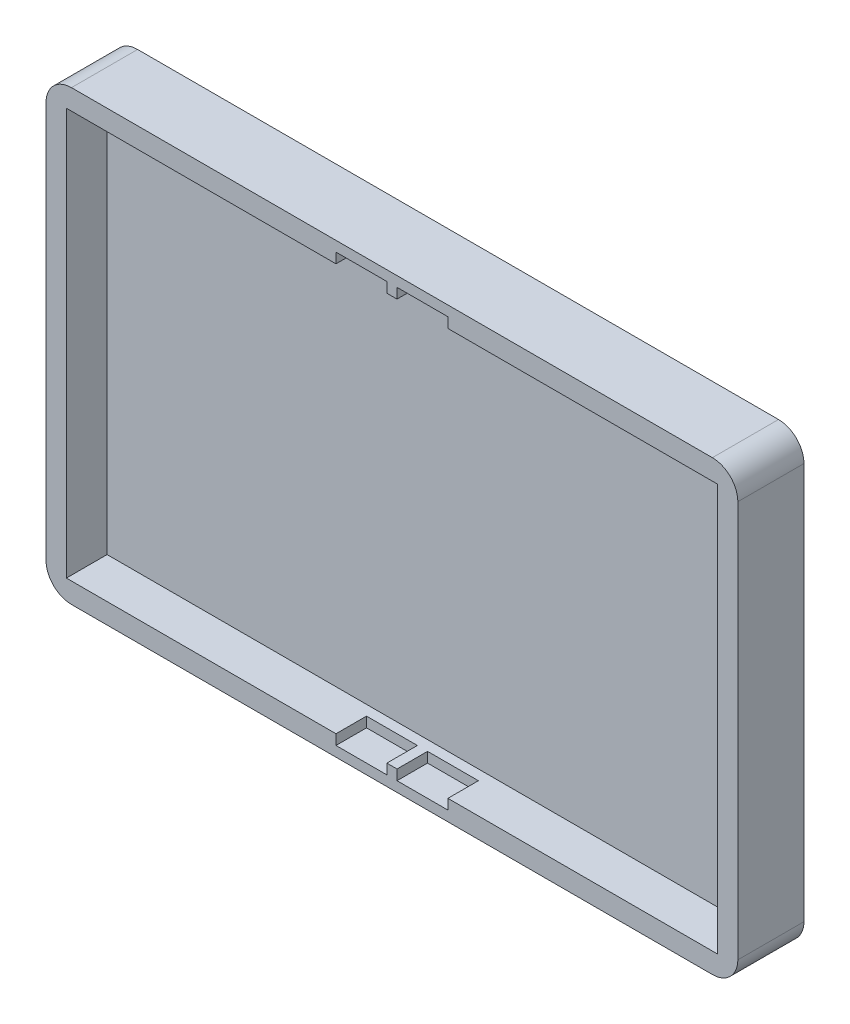
ISO-10303-21;
HEADER;
FILE_DESCRIPTION(('STEP AP214'),'2;1');
FILE_NAME('part.step','',(''),(''),'','','');
FILE_SCHEMA(('AUTOMOTIVE_DESIGN { 1 0 10303 214 1 1 1 1 }'));
ENDSEC;
DATA;
#1=APPLICATION_CONTEXT('core data for automotive mechanical design processes');
#2=APPLICATION_PROTOCOL_DEFINITION('international standard','automotive_design',2000,#1);
#3=PRODUCT_CONTEXT('',#1,'mechanical');
#4=PRODUCT('Part','Part','',(#3));
#5=PRODUCT_RELATED_PRODUCT_CATEGORY('part','',(#4));
#6=PRODUCT_DEFINITION_FORMATION('','',#4);
#7=PRODUCT_DEFINITION_CONTEXT('part definition',#1,'design');
#8=PRODUCT_DEFINITION('design','',#6,#7);
#9=PRODUCT_DEFINITION_SHAPE('','',#8);
#10=(LENGTH_UNIT() NAMED_UNIT(*) SI_UNIT(.MILLI.,.METRE.));
#11=(NAMED_UNIT(*) PLANE_ANGLE_UNIT() SI_UNIT($,.RADIAN.));
#12=(NAMED_UNIT(*) SI_UNIT($,.STERADIAN.) SOLID_ANGLE_UNIT());
#13=UNCERTAINTY_MEASURE_WITH_UNIT(LENGTH_MEASURE(1.E-05),#10,'distance_accuracy_value','');
#14=(GEOMETRIC_REPRESENTATION_CONTEXT(3) GLOBAL_UNCERTAINTY_ASSIGNED_CONTEXT((#13)) GLOBAL_UNIT_ASSIGNED_CONTEXT((#10,
#11,#12)) REPRESENTATION_CONTEXT('',''));
#15=CARTESIAN_POINT('',(0.,0.,0.));
#16=DIRECTION('',(0.,0.,1.));
#17=DIRECTION('',(1.,0.,0.));
#18=AXIS2_PLACEMENT_3D('',#15,#16,#17);
#19=CARTESIAN_POINT('',(66.,2.,2.5));
#20=DIRECTION('',(0.,-1.,0.));
#21=DIRECTION('',(1.,0.,0.));
#22=AXIS2_PLACEMENT_3D('',#19,#20,#21);
#23=PLANE('',#22);
#24=DIRECTION('',(1.,0.,0.));
#25=VECTOR('',#24,1.);
#26=CARTESIAN_POINT('',(66.,2.,6.5));
#27=LINE('',#26,#25);
#28=CARTESIAN_POINT('',(33.5,2.,6.5));
#29=VERTEX_POINT('',#28);
#30=CARTESIAN_POINT('',(34.5,2.,6.5));
#31=VERTEX_POINT('',#30);
#32=EDGE_CURVE('E406',#29,#31,#27,.T.);
#33=ORIENTED_EDGE('',*,*,#32,.T.);
#34=DIRECTION('',(0.,0.,1.));
#35=VECTOR('',#34,1.);
#36=CARTESIAN_POINT('',(34.5,2.,2.5));
#37=LINE('',#36,#35);
#38=CARTESIAN_POINT('',(34.5,2.,3.5));
#39=VERTEX_POINT('',#38);
#40=EDGE_CURVE('E358',#39,#31,#37,.T.);
#41=ORIENTED_EDGE('',*,*,#40,.F.);
#42=DIRECTION('',(-1.,0.,0.));
#43=VECTOR('',#42,1.);
#44=CARTESIAN_POINT('',(66.,2.,3.5));
#45=LINE('',#44,#43);
#46=CARTESIAN_POINT('',(39.5,2.,3.5));
#47=VERTEX_POINT('',#46);
#48=EDGE_CURVE('E355',#47,#39,#45,.T.);
#49=ORIENTED_EDGE('',*,*,#48,.F.);
#50=DIRECTION('',(0.,0.,-1.));
#51=VECTOR('',#50,1.);
#52=CARTESIAN_POINT('',(39.5,2.,2.5));
#53=LINE('',#52,#51);
#54=CARTESIAN_POINT('',(39.5,2.,6.5));
#55=VERTEX_POINT('',#54);
#56=EDGE_CURVE('E324',#55,#47,#53,.T.);
#57=ORIENTED_EDGE('',*,*,#56,.F.);
#58=CARTESIAN_POINT('',(66.,2.,6.5));
#59=VERTEX_POINT('',#58);
#60=EDGE_CURVE('E402',#55,#59,#27,.T.);
#61=ORIENTED_EDGE('',*,*,#60,.T.);
#62=DIRECTION('',(0.,0.,1.));
#63=VECTOR('',#62,1.);
#64=CARTESIAN_POINT('',(66.,2.,2.5));
#65=LINE('',#64,#63);
#66=CARTESIAN_POINT('',(66.,2.,2.5));
#67=VERTEX_POINT('',#66);
#68=EDGE_CURVE('E407',#67,#59,#65,.T.);
#69=ORIENTED_EDGE('',*,*,#68,.F.);
#70=DIRECTION('',(1.,0.,0.));
#71=VECTOR('',#70,1.);
#72=CARTESIAN_POINT('',(66.,2.,2.5));
#73=LINE('',#72,#71);
#74=CARTESIAN_POINT('',(2.,1.99999999999999,2.5));
#75=VERTEX_POINT('',#74);
#76=EDGE_CURVE('E385',#75,#67,#73,.T.);
#77=ORIENTED_EDGE('',*,*,#76,.F.);
#78=DIRECTION('',(0.,0.,1.));
#79=VECTOR('',#78,1.);
#80=CARTESIAN_POINT('',(2.,1.99999999999999,2.5));
#81=LINE('',#80,#79);
#82=CARTESIAN_POINT('',(2.,1.99999999999999,6.5));
#83=VERTEX_POINT('',#82);
#84=EDGE_CURVE('E412',#75,#83,#81,.T.);
#85=ORIENTED_EDGE('',*,*,#84,.T.);
#86=CARTESIAN_POINT('',(28.5,2.,6.5));
#87=VERTEX_POINT('',#86);
#88=EDGE_CURVE('E377',#83,#87,#27,.T.);
#89=ORIENTED_EDGE('',*,*,#88,.T.);
#90=DIRECTION('',(0.,0.,1.));
#91=VECTOR('',#90,1.);
#92=CARTESIAN_POINT('',(28.5,2.,2.5));
#93=LINE('',#92,#91);
#94=CARTESIAN_POINT('',(28.5,2.,3.5));
#95=VERTEX_POINT('',#94);
#96=EDGE_CURVE('E364',#95,#87,#93,.T.);
#97=ORIENTED_EDGE('',*,*,#96,.F.);
#98=DIRECTION('',(-1.,0.,0.));
#99=VECTOR('',#98,1.);
#100=CARTESIAN_POINT('',(66.,2.,3.50000000000001));
#101=LINE('',#100,#99);
#102=CARTESIAN_POINT('',(33.5,2.,3.5));
#103=VERTEX_POINT('',#102);
#104=EDGE_CURVE('E361',#103,#95,#101,.T.);
#105=ORIENTED_EDGE('',*,*,#104,.F.);
#106=DIRECTION('',(0.,0.,-1.));
#107=VECTOR('',#106,1.);
#108=CARTESIAN_POINT('',(33.5,2.,2.5));
#109=LINE('',#108,#107);
#110=EDGE_CURVE('E367',#29,#103,#109,.T.);
#111=ORIENTED_EDGE('',*,*,#110,.F.);
#112=EDGE_LOOP('',(#33,#41,#49,#57,#61,#69,#77,#85,#89,#97,#105,#111));
#113=FACE_BOUND('',#112,.T.);
#114=ADVANCED_FACE('F43',(#113),#23,.F.);
#115=CARTESIAN_POINT('',(66.,42.,2.5));
#116=DIRECTION('',(0.,1.,0.));
#117=DIRECTION('',(-1.,0.,0.));
#118=AXIS2_PLACEMENT_3D('',#115,#116,#117);
#119=PLANE('',#118);
#120=DIRECTION('',(0.,0.,-1.));
#121=VECTOR('',#120,1.);
#122=CARTESIAN_POINT('',(28.5,42.,2.5));
#123=LINE('',#122,#121);
#124=CARTESIAN_POINT('',(28.5,42.,6.5));
#125=VERTEX_POINT('',#124);
#126=CARTESIAN_POINT('',(28.5,42.,3.5));
#127=VERTEX_POINT('',#126);
#128=EDGE_CURVE('E463',#125,#127,#123,.T.);
#129=ORIENTED_EDGE('',*,*,#128,.F.);
#130=DIRECTION('',(-1.,0.,0.));
#131=VECTOR('',#130,1.);
#132=CARTESIAN_POINT('',(66.,42.,6.5));
#133=LINE('',#132,#131);
#134=CARTESIAN_POINT('',(2.,42.,6.5));
#135=VERTEX_POINT('',#134);
#136=EDGE_CURVE('E392',#125,#135,#133,.T.);
#137=ORIENTED_EDGE('',*,*,#136,.T.);
#138=DIRECTION('',(0.,0.,1.));
#139=VECTOR('',#138,1.);
#140=CARTESIAN_POINT('',(2.,42.,2.5));
#141=LINE('',#140,#139);
#142=CARTESIAN_POINT('',(2.,42.,2.5));
#143=VERTEX_POINT('',#142);
#144=EDGE_CURVE('E415',#143,#135,#141,.T.);
#145=ORIENTED_EDGE('',*,*,#144,.F.);
#146=DIRECTION('',(-1.,0.,0.));
#147=VECTOR('',#146,1.);
#148=CARTESIAN_POINT('',(66.,42.,2.5));
#149=LINE('',#148,#147);
#150=CARTESIAN_POINT('',(66.,42.,2.5));
#151=VERTEX_POINT('',#150);
#152=EDGE_CURVE('E376',#151,#143,#149,.T.);
#153=ORIENTED_EDGE('',*,*,#152,.F.);
#154=DIRECTION('',(0.,0.,1.));
#155=VECTOR('',#154,1.);
#156=CARTESIAN_POINT('',(66.,42.,2.5));
#157=LINE('',#156,#155);
#158=CARTESIAN_POINT('',(66.,42.,6.5));
#159=VERTEX_POINT('',#158);
#160=EDGE_CURVE('E389',#151,#159,#157,.T.);
#161=ORIENTED_EDGE('',*,*,#160,.T.);
#162=CARTESIAN_POINT('',(39.5,42.,6.5));
#163=VERTEX_POINT('',#162);
#164=EDGE_CURVE('E393',#159,#163,#133,.T.);
#165=ORIENTED_EDGE('',*,*,#164,.T.);
#166=DIRECTION('',(0.,0.,1.));
#167=VECTOR('',#166,1.);
#168=CARTESIAN_POINT('',(39.5,42.,2.5));
#169=LINE('',#168,#167);
#170=CARTESIAN_POINT('',(39.5,42.,3.5));
#171=VERTEX_POINT('',#170);
#172=EDGE_CURVE('E437',#171,#163,#169,.T.);
#173=ORIENTED_EDGE('',*,*,#172,.F.);
#174=DIRECTION('',(1.,0.,0.));
#175=VECTOR('',#174,1.);
#176=CARTESIAN_POINT('',(66.,42.,3.5));
#177=LINE('',#176,#175);
#178=CARTESIAN_POINT('',(34.5,42.,3.5));
#179=VERTEX_POINT('',#178);
#180=EDGE_CURVE('E453',#179,#171,#177,.T.);
#181=ORIENTED_EDGE('',*,*,#180,.F.);
#182=DIRECTION('',(0.,0.,-1.));
#183=VECTOR('',#182,1.);
#184=CARTESIAN_POINT('',(34.5,42.,2.5));
#185=LINE('',#184,#183);
#186=CARTESIAN_POINT('',(34.5,42.,6.5));
#187=VERTEX_POINT('',#186);
#188=EDGE_CURVE('E457',#187,#179,#185,.T.);
#189=ORIENTED_EDGE('',*,*,#188,.F.);
#190=CARTESIAN_POINT('',(33.5,42.,6.5));
#191=VERTEX_POINT('',#190);
#192=EDGE_CURVE('E398',#187,#191,#133,.T.);
#193=ORIENTED_EDGE('',*,*,#192,.T.);
#194=DIRECTION('',(0.,0.,1.));
#195=VECTOR('',#194,1.);
#196=CARTESIAN_POINT('',(33.5,42.,2.5));
#197=LINE('',#196,#195);
#198=CARTESIAN_POINT('',(33.5,42.,3.5));
#199=VERTEX_POINT('',#198);
#200=EDGE_CURVE('E250',#199,#191,#197,.T.);
#201=ORIENTED_EDGE('',*,*,#200,.F.);
#202=DIRECTION('',(1.,0.,0.));
#203=VECTOR('',#202,1.);
#204=CARTESIAN_POINT('',(66.,42.,3.50000000000001));
#205=LINE('',#204,#203);
#206=EDGE_CURVE('E460',#127,#199,#205,.T.);
#207=ORIENTED_EDGE('',*,*,#206,.F.);
#208=EDGE_LOOP('',(#129,#137,#145,#153,#161,#165,#173,#181,#189,#193,#201,#207));
#209=FACE_BOUND('',#208,.T.);
#210=ADVANCED_FACE('F536',(#209),#119,.F.);
#211=CARTESIAN_POINT('',(0.,0.,6.5));
#212=DIRECTION('',(1.,0.,0.));
#213=DIRECTION('',(0.,0.,-1.));
#214=AXIS2_PLACEMENT_3D('',#211,#212,#213);
#215=PLANE('',#214);
#216=DIRECTION('',(0.,-1.,0.));
#217=VECTOR('',#216,1.);
#218=CARTESIAN_POINT('',(0.,0.,6.5));
#219=LINE('',#218,#217);
#220=CARTESIAN_POINT('',(0.,41.5,6.5));
#221=VERTEX_POINT('',#220);
#222=CARTESIAN_POINT('',(0.,2.5,6.5));
#223=VERTEX_POINT('',#222);
#224=EDGE_CURVE('E422',#221,#223,#219,.T.);
#225=ORIENTED_EDGE('',*,*,#224,.F.);
#226=DIRECTION('',(0.,0.,-1.));
#227=VECTOR('',#226,1.);
#228=CARTESIAN_POINT('',(0.,41.5,6.5));
#229=LINE('',#228,#227);
#230=CARTESIAN_POINT('',(0.,41.5,0.));
#231=VERTEX_POINT('',#230);
#232=EDGE_CURVE('E472',#221,#231,#229,.T.);
#233=ORIENTED_EDGE('',*,*,#232,.T.);
#234=DIRECTION('',(0.,-1.,0.));
#235=VECTOR('',#234,1.);
#236=CARTESIAN_POINT('',(0.,0.,0.));
#237=LINE('',#236,#235);
#238=CARTESIAN_POINT('',(0.,2.5,0.));
#239=VERTEX_POINT('',#238);
#240=EDGE_CURVE('E411',#231,#239,#237,.T.);
#241=ORIENTED_EDGE('',*,*,#240,.T.);
#242=DIRECTION('',(0.,0.,-1.));
#243=VECTOR('',#242,1.);
#244=CARTESIAN_POINT('',(0.,2.5,6.5));
#245=LINE('',#244,#243);
#246=EDGE_CURVE('E469',#239,#223,#245,.F.);
#247=ORIENTED_EDGE('',*,*,#246,.T.);
#248=EDGE_LOOP('',(#225,#233,#241,#247));
#249=FACE_BOUND('',#248,.T.);
#250=ADVANCED_FACE('F606',(#249),#215,.F.);
#251=CARTESIAN_POINT('',(0.,0.,6.5));
#252=DIRECTION('',(0.,1.,0.));
#253=DIRECTION('',(0.,0.,1.));
#254=AXIS2_PLACEMENT_3D('',#251,#252,#253);
#255=PLANE('',#254);
#256=DIRECTION('',(1.,0.,0.));
#257=VECTOR('',#256,1.);
#258=CARTESIAN_POINT('',(0.,0.,6.5));
#259=LINE('',#258,#257);
#260=CARTESIAN_POINT('',(2.5,0.,6.5));
#261=VERTEX_POINT('',#260);
#262=CARTESIAN_POINT('',(65.5,0.,6.5));
#263=VERTEX_POINT('',#262);
#264=EDGE_CURVE('E426',#261,#263,#259,.T.);
#265=ORIENTED_EDGE('',*,*,#264,.F.);
#266=DIRECTION('',(0.,0.,-1.));
#267=VECTOR('',#266,1.);
#268=CARTESIAN_POINT('',(2.5,0.,6.5));
#269=LINE('',#268,#267);
#270=CARTESIAN_POINT('',(2.5,0.,0.));
#271=VERTEX_POINT('',#270);
#272=EDGE_CURVE('E509',#261,#271,#269,.T.);
#273=ORIENTED_EDGE('',*,*,#272,.T.);
#274=DIRECTION('',(1.,0.,0.));
#275=VECTOR('',#274,1.);
#276=CARTESIAN_POINT('',(0.,0.,0.));
#277=LINE('',#276,#275);
#278=CARTESIAN_POINT('',(65.5,0.,0.));
#279=VERTEX_POINT('',#278);
#280=EDGE_CURVE('E441',#271,#279,#277,.T.);
#281=ORIENTED_EDGE('',*,*,#280,.T.);
#282=DIRECTION('',(0.,0.,-1.));
#283=VECTOR('',#282,1.);
#284=CARTESIAN_POINT('',(65.5,0.,6.5));
#285=LINE('',#284,#283);
#286=EDGE_CURVE('E506',#279,#263,#285,.F.);
#287=ORIENTED_EDGE('',*,*,#286,.T.);
#288=EDGE_LOOP('',(#265,#273,#281,#287));
#289=FACE_BOUND('',#288,.T.);
#290=ADVANCED_FACE('F630',(#289),#255,.F.);
#291=CARTESIAN_POINT('',(68.,0.,6.5));
#292=DIRECTION('',(-1.,0.,0.));
#293=DIRECTION('',(0.,0.,1.));
#294=AXIS2_PLACEMENT_3D('',#291,#292,#293);
#295=PLANE('',#294);
#296=DIRECTION('',(0.,1.,0.));
#297=VECTOR('',#296,1.);
#298=CARTESIAN_POINT('',(68.,0.,6.5));
#299=LINE('',#298,#297);
#300=CARTESIAN_POINT('',(68.,2.5,6.5));
#301=VERTEX_POINT('',#300);
#302=CARTESIAN_POINT('',(68.,41.5,6.5));
#303=VERTEX_POINT('',#302);
#304=EDGE_CURVE('E430',#301,#303,#299,.T.);
#305=ORIENTED_EDGE('',*,*,#304,.F.);
#306=DIRECTION('',(0.,0.,-1.));
#307=VECTOR('',#306,1.);
#308=CARTESIAN_POINT('',(68.,2.5,6.5));
#309=LINE('',#308,#307);
#310=CARTESIAN_POINT('',(68.,2.5,0.));
#311=VERTEX_POINT('',#310);
#312=EDGE_CURVE('E11',#301,#311,#309,.T.);
#313=ORIENTED_EDGE('',*,*,#312,.T.);
#314=DIRECTION('',(0.,1.,0.));
#315=VECTOR('',#314,1.);
#316=CARTESIAN_POINT('',(68.,0.,0.));
#317=LINE('',#316,#315);
#318=CARTESIAN_POINT('',(68.,41.5,0.));
#319=VERTEX_POINT('',#318);
#320=EDGE_CURVE('E445',#311,#319,#317,.T.);
#321=ORIENTED_EDGE('',*,*,#320,.T.);
#322=DIRECTION('',(0.,0.,-1.));
#323=VECTOR('',#322,1.);
#324=CARTESIAN_POINT('',(68.,41.5,6.5));
#325=LINE('',#324,#323);
#326=EDGE_CURVE('E52',#319,#303,#325,.F.);
#327=ORIENTED_EDGE('',*,*,#326,.T.);
#328=EDGE_LOOP('',(#305,#313,#321,#327));
#329=FACE_BOUND('',#328,.T.);
#330=ADVANCED_FACE('F626',(#329),#295,.F.);
#331=CARTESIAN_POINT('',(0.,44.,6.5));
#332=DIRECTION('',(0.,-1.,0.));
#333=DIRECTION('',(0.,0.,-1.));
#334=AXIS2_PLACEMENT_3D('',#331,#332,#333);
#335=PLANE('',#334);
#336=DIRECTION('',(-1.,0.,0.));
#337=VECTOR('',#336,1.);
#338=CARTESIAN_POINT('',(0.,44.,0.));
#339=LINE('',#338,#337);
#340=CARTESIAN_POINT('',(65.5,44.,0.));
#341=VERTEX_POINT('',#340);
#342=CARTESIAN_POINT('',(2.5,44.,0.));
#343=VERTEX_POINT('',#342);
#344=EDGE_CURVE('E427',#341,#343,#339,.T.);
#345=ORIENTED_EDGE('',*,*,#344,.T.);
#346=DIRECTION('',(0.,0.,-1.));
#347=VECTOR('',#346,1.);
#348=CARTESIAN_POINT('',(2.5,44.,6.5));
#349=LINE('',#348,#347);
#350=CARTESIAN_POINT('',(2.5,44.,6.5));
#351=VERTEX_POINT('',#350);
#352=EDGE_CURVE('E492',#343,#351,#349,.F.);
#353=ORIENTED_EDGE('',*,*,#352,.T.);
#354=DIRECTION('',(-1.,0.,0.));
#355=VECTOR('',#354,1.);
#356=CARTESIAN_POINT('',(0.,44.,6.5));
#357=LINE('',#356,#355);
#358=CARTESIAN_POINT('',(65.5,44.,6.5));
#359=VERTEX_POINT('',#358);
#360=EDGE_CURVE('E433',#359,#351,#357,.T.);
#361=ORIENTED_EDGE('',*,*,#360,.F.);
#362=DIRECTION('',(0.,0.,-1.));
#363=VECTOR('',#362,1.);
#364=CARTESIAN_POINT('',(65.5,44.,6.5));
#365=LINE('',#364,#363);
#366=EDGE_CURVE('E488',#359,#341,#365,.T.);
#367=ORIENTED_EDGE('',*,*,#366,.T.);
#368=EDGE_LOOP('',(#345,#353,#361,#367));
#369=FACE_BOUND('',#368,.T.);
#370=ADVANCED_FACE('F620',(#369),#335,.F.);
#371=CARTESIAN_POINT('',(0.,0.,6.5));
#372=DIRECTION('',(0.,0.,-1.));
#373=DIRECTION('',(-1.,0.,0.));
#374=AXIS2_PLACEMENT_3D('',#371,#372,#373);
#375=PLANE('',#374);
#376=ORIENTED_EDGE('',*,*,#136,.F.);
#377=DIRECTION('',(0.,-1.,0.));
#378=VECTOR('',#377,1.);
#379=CARTESIAN_POINT('',(28.5,43.,6.5));
#380=LINE('',#379,#378);
#381=CARTESIAN_POINT('',(28.5,43.,6.5));
#382=VERTEX_POINT('',#381);
#383=EDGE_CURVE('E255',#382,#125,#380,.T.);
#384=ORIENTED_EDGE('',*,*,#383,.F.);
#385=DIRECTION('',(-1.,0.,0.));
#386=VECTOR('',#385,1.);
#387=CARTESIAN_POINT('',(28.5,43.,6.5));
#388=LINE('',#387,#386);
#389=CARTESIAN_POINT('',(33.5,43.,6.5));
#390=VERTEX_POINT('',#389);
#391=EDGE_CURVE('E236',#390,#382,#388,.T.);
#392=ORIENTED_EDGE('',*,*,#391,.F.);
#393=DIRECTION('',(0.,-1.,0.));
#394=VECTOR('',#393,1.);
#395=CARTESIAN_POINT('',(33.5,43.,6.5));
#396=LINE('',#395,#394);
#397=EDGE_CURVE('E247',#390,#191,#396,.T.);
#398=ORIENTED_EDGE('',*,*,#397,.T.);
#399=ORIENTED_EDGE('',*,*,#192,.F.);
#400=DIRECTION('',(0.,-1.,0.));
#401=VECTOR('',#400,1.);
#402=CARTESIAN_POINT('',(34.5,43.,6.5));
#403=LINE('',#402,#401);
#404=CARTESIAN_POINT('',(34.5,43.,6.5));
#405=VERTEX_POINT('',#404);
#406=EDGE_CURVE('E282',#405,#187,#403,.T.);
#407=ORIENTED_EDGE('',*,*,#406,.F.);
#408=DIRECTION('',(-1.,0.,0.));
#409=VECTOR('',#408,1.);
#410=CARTESIAN_POINT('',(39.5,43.,6.5));
#411=LINE('',#410,#409);
#412=CARTESIAN_POINT('',(39.5,43.,6.5));
#413=VERTEX_POINT('',#412);
#414=EDGE_CURVE('E274',#413,#405,#411,.T.);
#415=ORIENTED_EDGE('',*,*,#414,.F.);
#416=DIRECTION('',(0.,-1.,0.));
#417=VECTOR('',#416,1.);
#418=CARTESIAN_POINT('',(39.5,43.,6.5));
#419=LINE('',#418,#417);
#420=EDGE_CURVE('E281',#413,#163,#419,.T.);
#421=ORIENTED_EDGE('',*,*,#420,.T.);
#422=ORIENTED_EDGE('',*,*,#164,.F.);
#423=DIRECTION('',(0.,1.,0.));
#424=VECTOR('',#423,1.);
#425=CARTESIAN_POINT('',(66.,42.,6.5));
#426=LINE('',#425,#424);
#427=EDGE_CURVE('E371',#59,#159,#426,.T.);
#428=ORIENTED_EDGE('',*,*,#427,.F.);
#429=ORIENTED_EDGE('',*,*,#60,.F.);
#430=DIRECTION('',(0.,1.,0.));
#431=VECTOR('',#430,1.);
#432=CARTESIAN_POINT('',(39.5,0.999999999999997,6.5));
#433=LINE('',#432,#431);
#434=CARTESIAN_POINT('',(39.5,0.999999999999997,6.5));
#435=VERTEX_POINT('',#434);
#436=EDGE_CURVE('E270',#435,#55,#433,.T.);
#437=ORIENTED_EDGE('',*,*,#436,.F.);
#438=DIRECTION('',(1.,0.,0.));
#439=VECTOR('',#438,1.);
#440=CARTESIAN_POINT('',(34.5,0.999999999999996,6.5));
#441=LINE('',#440,#439);
#442=CARTESIAN_POINT('',(34.5,0.999999999999996,6.5));
#443=VERTEX_POINT('',#442);
#444=EDGE_CURVE('E264',#443,#435,#441,.T.);
#445=ORIENTED_EDGE('',*,*,#444,.F.);
#446=DIRECTION('',(0.,1.,0.));
#447=VECTOR('',#446,1.);
#448=CARTESIAN_POINT('',(34.5,0.999999999999996,6.5));
#449=LINE('',#448,#447);
#450=EDGE_CURVE('E269',#443,#31,#449,.T.);
#451=ORIENTED_EDGE('',*,*,#450,.T.);
#452=ORIENTED_EDGE('',*,*,#32,.F.);
#453=DIRECTION('',(0.,1.,0.));
#454=VECTOR('',#453,1.);
#455=CARTESIAN_POINT('',(33.5,0.999999999999996,6.5));
#456=LINE('',#455,#454);
#457=CARTESIAN_POINT('',(33.5,0.999999999999996,6.5));
#458=VERTEX_POINT('',#457);
#459=EDGE_CURVE('E294',#458,#29,#456,.T.);
#460=ORIENTED_EDGE('',*,*,#459,.F.);
#461=DIRECTION('',(1.,0.,0.));
#462=VECTOR('',#461,1.);
#463=CARTESIAN_POINT('',(28.5,0.999999999999995,6.5));
#464=LINE('',#463,#462);
#465=CARTESIAN_POINT('',(28.5,0.999999999999995,6.5));
#466=VERTEX_POINT('',#465);
#467=EDGE_CURVE('E286',#466,#458,#464,.T.);
#468=ORIENTED_EDGE('',*,*,#467,.F.);
#469=DIRECTION('',(0.,1.,0.));
#470=VECTOR('',#469,1.);
#471=CARTESIAN_POINT('',(28.5,0.999999999999995,6.5));
#472=LINE('',#471,#470);
#473=EDGE_CURVE('E293',#466,#87,#472,.T.);
#474=ORIENTED_EDGE('',*,*,#473,.T.);
#475=ORIENTED_EDGE('',*,*,#88,.F.);
#476=DIRECTION('',(0.,-1.,0.));
#477=VECTOR('',#476,1.);
#478=CARTESIAN_POINT('',(2.,42.,6.5));
#479=LINE('',#478,#477);
#480=EDGE_CURVE('E397',#135,#83,#479,.T.);
#481=ORIENTED_EDGE('',*,*,#480,.F.);
#482=EDGE_LOOP('',(#376,#384,#392,#398,#399,#407,#415,#421,#422,#428,#429,#437,#445,#451,#452,
#460,#468,#474,#475,#481));
#483=FACE_BOUND('',#482,.T.);
#484=ORIENTED_EDGE('',*,*,#360,.T.);
#485=CARTESIAN_POINT('',(2.5,41.5,6.5));
#486=DIRECTION('',(0.,0.,-1.));
#487=DIRECTION('',(-1.,0.,0.));
#488=AXIS2_PLACEMENT_3D('',#485,#486,#487);
#489=CIRCLE('',#488,2.5);
#490=EDGE_CURVE('E503',#351,#221,#489,.F.);
#491=ORIENTED_EDGE('',*,*,#490,.T.);
#492=ORIENTED_EDGE('',*,*,#224,.T.);
#493=CARTESIAN_POINT('',(2.5,2.5,6.5));
#494=DIRECTION('',(0.,0.,-1.));
#495=DIRECTION('',(-1.,0.,0.));
#496=AXIS2_PLACEMENT_3D('',#493,#494,#495);
#497=CIRCLE('',#496,2.5);
#498=EDGE_CURVE('E500',#223,#261,#497,.F.);
#499=ORIENTED_EDGE('',*,*,#498,.T.);
#500=ORIENTED_EDGE('',*,*,#264,.T.);
#501=CARTESIAN_POINT('',(65.5,2.5,6.5));
#502=DIRECTION('',(0.,0.,-1.));
#503=DIRECTION('',(-1.,0.,0.));
#504=AXIS2_PLACEMENT_3D('',#501,#502,#503);
#505=CIRCLE('',#504,2.5);
#506=EDGE_CURVE('E65',#263,#301,#505,.F.);
#507=ORIENTED_EDGE('',*,*,#506,.T.);
#508=ORIENTED_EDGE('',*,*,#304,.T.);
#509=CARTESIAN_POINT('',(65.5,41.5,6.5));
#510=DIRECTION('',(0.,0.,-1.));
#511=DIRECTION('',(-1.,0.,0.));
#512=AXIS2_PLACEMENT_3D('',#509,#510,#511);
#513=CIRCLE('',#512,2.5);
#514=EDGE_CURVE('E495',#303,#359,#513,.F.);
#515=ORIENTED_EDGE('',*,*,#514,.T.);
#516=EDGE_LOOP('',(#484,#491,#492,#499,#500,#507,#508,#515));
#517=FACE_BOUND('',#516,.T.);
#518=ADVANCED_FACE('F258',(#483,#517),#375,.F.);
#519=CARTESIAN_POINT('',(0.,0.,0.));
#520=DIRECTION('',(0.,0.,-1.));
#521=DIRECTION('',(-1.,0.,0.));
#522=AXIS2_PLACEMENT_3D('',#519,#520,#521);
#523=PLANE('',#522);
#524=ORIENTED_EDGE('',*,*,#240,.F.);
#525=CARTESIAN_POINT('',(2.5,41.5,0.));
#526=DIRECTION('',(0.,0.,-1.));
#527=DIRECTION('',(-1.,0.,0.));
#528=AXIS2_PLACEMENT_3D('',#525,#526,#527);
#529=CIRCLE('',#528,2.5);
#530=EDGE_CURVE('E485',#231,#343,#529,.T.);
#531=ORIENTED_EDGE('',*,*,#530,.T.);
#532=ORIENTED_EDGE('',*,*,#344,.F.);
#533=CARTESIAN_POINT('',(65.5,41.5,0.));
#534=DIRECTION('',(0.,0.,-1.));
#535=DIRECTION('',(-1.,0.,0.));
#536=AXIS2_PLACEMENT_3D('',#533,#534,#535);
#537=CIRCLE('',#536,2.5);
#538=EDGE_CURVE('E476',#341,#319,#537,.T.);
#539=ORIENTED_EDGE('',*,*,#538,.T.);
#540=ORIENTED_EDGE('',*,*,#320,.F.);
#541=CARTESIAN_POINT('',(65.5,2.5,0.));
#542=DIRECTION('',(0.,0.,-1.));
#543=DIRECTION('',(-1.,0.,0.));
#544=AXIS2_PLACEMENT_3D('',#541,#542,#543);
#545=CIRCLE('',#544,2.5);
#546=EDGE_CURVE('E479',#311,#279,#545,.T.);
#547=ORIENTED_EDGE('',*,*,#546,.T.);
#548=ORIENTED_EDGE('',*,*,#280,.F.);
#549=CARTESIAN_POINT('',(2.5,2.5,0.));
#550=DIRECTION('',(0.,0.,-1.));
#551=DIRECTION('',(-1.,0.,0.));
#552=AXIS2_PLACEMENT_3D('',#549,#550,#551);
#553=CIRCLE('',#552,2.5);
#554=EDGE_CURVE('E482',#271,#239,#553,.T.);
#555=ORIENTED_EDGE('',*,*,#554,.T.);
#556=EDGE_LOOP('',(#524,#531,#532,#539,#540,#547,#548,#555));
#557=FACE_BOUND('',#556,.T.);
#558=ADVANCED_FACE('F617',(#557),#523,.T.);
#559=CARTESIAN_POINT('',(66.,42.,2.5));
#560=DIRECTION('',(1.,0.,0.));
#561=DIRECTION('',(0.,0.,-1.));
#562=AXIS2_PLACEMENT_3D('',#559,#560,#561);
#563=PLANE('',#562);
#564=ORIENTED_EDGE('',*,*,#427,.T.);
#565=ORIENTED_EDGE('',*,*,#160,.F.);
#566=DIRECTION('',(0.,1.,0.));
#567=VECTOR('',#566,1.);
#568=CARTESIAN_POINT('',(66.,42.,2.5));
#569=LINE('',#568,#567);
#570=EDGE_CURVE('E372',#67,#151,#569,.T.);
#571=ORIENTED_EDGE('',*,*,#570,.F.);
#572=ORIENTED_EDGE('',*,*,#68,.T.);
#573=EDGE_LOOP('',(#564,#565,#571,#572));
#574=FACE_BOUND('',#573,.T.);
#575=ADVANCED_FACE('F546',(#574),#563,.F.);
#576=CARTESIAN_POINT('',(2.,42.,2.5));
#577=DIRECTION('',(-1.,0.,0.));
#578=DIRECTION('',(0.,0.,1.));
#579=AXIS2_PLACEMENT_3D('',#576,#577,#578);
#580=PLANE('',#579);
#581=ORIENTED_EDGE('',*,*,#480,.T.);
#582=ORIENTED_EDGE('',*,*,#84,.F.);
#583=DIRECTION('',(0.,-1.,0.));
#584=VECTOR('',#583,1.);
#585=CARTESIAN_POINT('',(2.,42.,2.5));
#586=LINE('',#585,#584);
#587=EDGE_CURVE('E381',#143,#75,#586,.T.);
#588=ORIENTED_EDGE('',*,*,#587,.F.);
#589=ORIENTED_EDGE('',*,*,#144,.T.);
#590=EDGE_LOOP('',(#581,#582,#588,#589));
#591=FACE_BOUND('',#590,.T.);
#592=ADVANCED_FACE('F611',(#591),#580,.F.);
#593=CARTESIAN_POINT('',(0.,0.,2.5));
#594=DIRECTION('',(0.,0.,-1.));
#595=DIRECTION('',(-1.,0.,0.));
#596=AXIS2_PLACEMENT_3D('',#593,#594,#595);
#597=PLANE('',#596);
#598=ORIENTED_EDGE('',*,*,#570,.T.);
#599=ORIENTED_EDGE('',*,*,#152,.T.);
#600=ORIENTED_EDGE('',*,*,#587,.T.);
#601=ORIENTED_EDGE('',*,*,#76,.T.);
#602=EDGE_LOOP('',(#598,#599,#600,#601));
#603=FACE_BOUND('',#602,.T.);
#604=ADVANCED_FACE('F551',(#603),#597,.F.);
#605=CARTESIAN_POINT('',(0.,43.,0.));
#606=DIRECTION('',(0.,-1.,0.));
#607=DIRECTION('',(0.,0.,-1.));
#608=AXIS2_PLACEMENT_3D('',#605,#606,#607);
#609=PLANE('',#608);
#610=DIRECTION('',(0.,0.,1.));
#611=VECTOR('',#610,1.);
#612=CARTESIAN_POINT('',(39.5,43.,5.5));
#613=LINE('',#612,#611);
#614=CARTESIAN_POINT('',(39.5,43.,3.5));
#615=VERTEX_POINT('',#614);
#616=EDGE_CURVE('E343',#615,#413,#613,.T.);
#617=ORIENTED_EDGE('',*,*,#616,.T.);
#618=ORIENTED_EDGE('',*,*,#414,.T.);
#619=DIRECTION('',(0.,0.,-1.));
#620=VECTOR('',#619,1.);
#621=CARTESIAN_POINT('',(34.5,43.,5.5));
#622=LINE('',#621,#620);
#623=CARTESIAN_POINT('',(34.5,43.,3.5));
#624=VERTEX_POINT('',#623);
#625=EDGE_CURVE('E244',#405,#624,#622,.T.);
#626=ORIENTED_EDGE('',*,*,#625,.T.);
#627=DIRECTION('',(1.,0.,0.));
#628=VECTOR('',#627,1.);
#629=CARTESIAN_POINT('',(39.5,43.,3.5));
#630=LINE('',#629,#628);
#631=EDGE_CURVE('E346',#624,#615,#630,.T.);
#632=ORIENTED_EDGE('',*,*,#631,.T.);
#633=EDGE_LOOP('',(#617,#618,#626,#632));
#634=FACE_BOUND('',#633,.T.);
#635=ADVANCED_FACE('F531',(#634),#609,.T.);
#636=CARTESIAN_POINT('',(39.5,0.999999999999973,5.5));
#637=DIRECTION('',(-1.,0.,0.));
#638=DIRECTION('',(0.,-1.,0.));
#639=AXIS2_PLACEMENT_3D('',#636,#637,#638);
#640=PLANE('',#639);
#641=ORIENTED_EDGE('',*,*,#172,.T.);
#642=ORIENTED_EDGE('',*,*,#420,.F.);
#643=ORIENTED_EDGE('',*,*,#616,.F.);
#644=DIRECTION('',(0.,1.,0.));
#645=VECTOR('',#644,1.);
#646=CARTESIAN_POINT('',(39.5,0.999999999999973,3.5));
#647=LINE('',#646,#645);
#648=EDGE_CURVE('E329',#171,#615,#647,.T.);
#649=ORIENTED_EDGE('',*,*,#648,.F.);
#650=EDGE_LOOP('',(#641,#642,#643,#649));
#651=FACE_BOUND('',#650,.T.);
#652=ADVANCED_FACE('F541',(#651),#640,.T.);
#653=CARTESIAN_POINT('',(39.5,0.999999999999973,3.5));
#654=DIRECTION('',(0.,0.,1.));
#655=DIRECTION('',(1.,0.,0.));
#656=AXIS2_PLACEMENT_3D('',#653,#654,#655);
#657=PLANE('',#656);
#658=ORIENTED_EDGE('',*,*,#180,.T.);
#659=ORIENTED_EDGE('',*,*,#648,.T.);
#660=ORIENTED_EDGE('',*,*,#631,.F.);
#661=DIRECTION('',(0.,1.,0.));
#662=VECTOR('',#661,1.);
#663=CARTESIAN_POINT('',(34.5,0.999999999999973,3.5));
#664=LINE('',#663,#662);
#665=EDGE_CURVE('E298',#179,#624,#664,.T.);
#666=ORIENTED_EDGE('',*,*,#665,.F.);
#667=EDGE_LOOP('',(#658,#659,#660,#666));
#668=FACE_BOUND('',#667,.T.);
#669=ADVANCED_FACE('F528',(#668),#657,.T.);
#670=CARTESIAN_POINT('',(34.5,0.999999999999973,5.5));
#671=DIRECTION('',(1.,0.,0.));
#672=DIRECTION('',(0.,1.,0.));
#673=AXIS2_PLACEMENT_3D('',#670,#671,#672);
#674=PLANE('',#673);
#675=ORIENTED_EDGE('',*,*,#188,.T.);
#676=ORIENTED_EDGE('',*,*,#665,.T.);
#677=ORIENTED_EDGE('',*,*,#625,.F.);
#678=ORIENTED_EDGE('',*,*,#406,.T.);
#679=EDGE_LOOP('',(#675,#676,#677,#678));
#680=FACE_BOUND('',#679,.T.);
#681=ADVANCED_FACE('F525',(#680),#674,.T.);
#682=CARTESIAN_POINT('',(0.,43.,0.));
#683=DIRECTION('',(0.,1.,0.));
#684=DIRECTION('',(-1.,0.,0.));
#685=AXIS2_PLACEMENT_3D('',#682,#683,#684);
#686=PLANE('',#685);
#687=DIRECTION('',(0.,0.,1.));
#688=VECTOR('',#687,1.);
#689=CARTESIAN_POINT('',(33.5,43.,5.5));
#690=LINE('',#689,#688);
#691=CARTESIAN_POINT('',(33.5,43.,3.5));
#692=VERTEX_POINT('',#691);
#693=EDGE_CURVE('E231',#692,#390,#690,.T.);
#694=ORIENTED_EDGE('',*,*,#693,.T.);
#695=ORIENTED_EDGE('',*,*,#391,.T.);
#696=DIRECTION('',(0.,0.,-1.));
#697=VECTOR('',#696,1.);
#698=CARTESIAN_POINT('',(28.5,43.,5.5));
#699=LINE('',#698,#697);
#700=CARTESIAN_POINT('',(28.5,43.,3.5));
#701=VERTEX_POINT('',#700);
#702=EDGE_CURVE('E243',#382,#701,#699,.T.);
#703=ORIENTED_EDGE('',*,*,#702,.T.);
#704=DIRECTION('',(1.,0.,0.));
#705=VECTOR('',#704,1.);
#706=CARTESIAN_POINT('',(33.5,43.,3.5));
#707=LINE('',#706,#705);
#708=EDGE_CURVE('E239',#701,#692,#707,.T.);
#709=ORIENTED_EDGE('',*,*,#708,.T.);
#710=EDGE_LOOP('',(#694,#695,#703,#709));
#711=FACE_BOUND('',#710,.T.);
#712=ADVANCED_FACE('F233',(#711),#686,.F.);
#713=CARTESIAN_POINT('',(33.5,0.999999999999973,3.5));
#714=DIRECTION('',(0.,0.,1.));
#715=DIRECTION('',(1.,0.,0.));
#716=AXIS2_PLACEMENT_3D('',#713,#714,#715);
#717=PLANE('',#716);
#718=ORIENTED_EDGE('',*,*,#206,.T.);
#719=DIRECTION('',(0.,1.,0.));
#720=VECTOR('',#719,1.);
#721=CARTESIAN_POINT('',(33.5,0.999999999999973,3.5));
#722=LINE('',#721,#720);
#723=EDGE_CURVE('E315',#199,#692,#722,.T.);
#724=ORIENTED_EDGE('',*,*,#723,.T.);
#725=ORIENTED_EDGE('',*,*,#708,.F.);
#726=DIRECTION('',(0.,1.,0.));
#727=VECTOR('',#726,1.);
#728=CARTESIAN_POINT('',(28.5,0.999999999999966,3.5));
#729=LINE('',#728,#727);
#730=EDGE_CURVE('E319',#127,#701,#729,.T.);
#731=ORIENTED_EDGE('',*,*,#730,.F.);
#732=EDGE_LOOP('',(#718,#724,#725,#731));
#733=FACE_BOUND('',#732,.T.);
#734=ADVANCED_FACE('F590',(#733),#717,.T.);
#735=CARTESIAN_POINT('',(28.5,0.999999999999966,5.5));
#736=DIRECTION('',(1.,0.,0.));
#737=DIRECTION('',(0.,1.,0.));
#738=AXIS2_PLACEMENT_3D('',#735,#736,#737);
#739=PLANE('',#738);
#740=ORIENTED_EDGE('',*,*,#128,.T.);
#741=ORIENTED_EDGE('',*,*,#730,.T.);
#742=ORIENTED_EDGE('',*,*,#702,.F.);
#743=ORIENTED_EDGE('',*,*,#383,.T.);
#744=EDGE_LOOP('',(#740,#741,#742,#743));
#745=FACE_BOUND('',#744,.T.);
#746=ADVANCED_FACE('F598',(#745),#739,.T.);
#747=CARTESIAN_POINT('',(33.5,0.999999999999973,5.5));
#748=DIRECTION('',(-1.,0.,0.));
#749=DIRECTION('',(0.,-1.,0.));
#750=AXIS2_PLACEMENT_3D('',#747,#748,#749);
#751=PLANE('',#750);
#752=ORIENTED_EDGE('',*,*,#200,.T.);
#753=ORIENTED_EDGE('',*,*,#397,.F.);
#754=ORIENTED_EDGE('',*,*,#693,.F.);
#755=ORIENTED_EDGE('',*,*,#723,.F.);
#756=EDGE_LOOP('',(#752,#753,#754,#755));
#757=FACE_BOUND('',#756,.T.);
#758=ADVANCED_FACE('F248',(#757),#751,.T.);
#759=ORIENTED_EDGE('',*,*,#40,.T.);
#760=ORIENTED_EDGE('',*,*,#450,.F.);
#761=DIRECTION('',(0.,0.,-1.));
#762=VECTOR('',#761,1.);
#763=CARTESIAN_POINT('',(34.5,0.999999999999973,5.5));
#764=LINE('',#763,#762);
#765=CARTESIAN_POINT('',(34.5,0.999999999999973,3.5));
#766=VERTEX_POINT('',#765);
#767=EDGE_CURVE('E340',#443,#766,#764,.T.);
#768=ORIENTED_EDGE('',*,*,#767,.T.);
#769=EDGE_CURVE('E325',#766,#39,#664,.T.);
#770=ORIENTED_EDGE('',*,*,#769,.T.);
#771=EDGE_LOOP('',(#759,#760,#768,#770));
#772=FACE_BOUND('',#771,.T.);
#773=ADVANCED_FACE('F568',(#772),#674,.T.);
#774=ORIENTED_EDGE('',*,*,#48,.T.);
#775=ORIENTED_EDGE('',*,*,#769,.F.);
#776=DIRECTION('',(1.,0.,0.));
#777=VECTOR('',#776,1.);
#778=CARTESIAN_POINT('',(39.5,0.999999999999973,3.5));
#779=LINE('',#778,#777);
#780=CARTESIAN_POINT('',(39.5,0.999999999999973,3.5));
#781=VERTEX_POINT('',#780);
#782=EDGE_CURVE('E337',#766,#781,#779,.T.);
#783=ORIENTED_EDGE('',*,*,#782,.T.);
#784=EDGE_CURVE('E330',#781,#47,#647,.T.);
#785=ORIENTED_EDGE('',*,*,#784,.T.);
#786=EDGE_LOOP('',(#774,#775,#783,#785));
#787=FACE_BOUND('',#786,.T.);
#788=ADVANCED_FACE('F741',(#787),#657,.T.);
#789=ORIENTED_EDGE('',*,*,#56,.T.);
#790=ORIENTED_EDGE('',*,*,#784,.F.);
#791=DIRECTION('',(0.,0.,1.));
#792=VECTOR('',#791,1.);
#793=CARTESIAN_POINT('',(39.5,0.999999999999973,5.5));
#794=LINE('',#793,#792);
#795=EDGE_CURVE('E334',#781,#435,#794,.T.);
#796=ORIENTED_EDGE('',*,*,#795,.T.);
#797=ORIENTED_EDGE('',*,*,#436,.T.);
#798=EDGE_LOOP('',(#789,#790,#796,#797));
#799=FACE_BOUND('',#798,.T.);
#800=ADVANCED_FACE('F558',(#799),#640,.T.);
#801=CARTESIAN_POINT('',(0.,0.999999999999973,0.));
#802=DIRECTION('',(0.,-1.,0.));
#803=DIRECTION('',(0.,0.,-1.));
#804=AXIS2_PLACEMENT_3D('',#801,#802,#803);
#805=PLANE('',#804);
#806=ORIENTED_EDGE('',*,*,#767,.F.);
#807=ORIENTED_EDGE('',*,*,#444,.T.);
#808=ORIENTED_EDGE('',*,*,#795,.F.);
#809=ORIENTED_EDGE('',*,*,#782,.F.);
#810=EDGE_LOOP('',(#806,#807,#808,#809));
#811=FACE_BOUND('',#810,.T.);
#812=ADVANCED_FACE('F564',(#811),#805,.F.);
#813=ORIENTED_EDGE('',*,*,#110,.T.);
#814=CARTESIAN_POINT('',(33.5,0.999999999999973,3.5));
#815=VERTEX_POINT('',#814);
#816=EDGE_CURVE('E316',#815,#103,#722,.T.);
#817=ORIENTED_EDGE('',*,*,#816,.F.);
#818=DIRECTION('',(0.,0.,1.));
#819=VECTOR('',#818,1.);
#820=CARTESIAN_POINT('',(33.5,0.999999999999973,5.5));
#821=LINE('',#820,#819);
#822=EDGE_CURVE('E306',#815,#458,#821,.T.);
#823=ORIENTED_EDGE('',*,*,#822,.T.);
#824=ORIENTED_EDGE('',*,*,#459,.T.);
#825=EDGE_LOOP('',(#813,#817,#823,#824));
#826=FACE_BOUND('',#825,.T.);
#827=ADVANCED_FACE('F573',(#826),#751,.T.);
#828=ORIENTED_EDGE('',*,*,#96,.T.);
#829=ORIENTED_EDGE('',*,*,#473,.F.);
#830=DIRECTION('',(0.,0.,-1.));
#831=VECTOR('',#830,1.);
#832=CARTESIAN_POINT('',(28.5,0.999999999999966,5.5));
#833=LINE('',#832,#831);
#834=CARTESIAN_POINT('',(28.5,0.999999999999966,3.5));
#835=VERTEX_POINT('',#834);
#836=EDGE_CURVE('E309',#466,#835,#833,.T.);
#837=ORIENTED_EDGE('',*,*,#836,.T.);
#838=EDGE_CURVE('E320',#835,#95,#729,.T.);
#839=ORIENTED_EDGE('',*,*,#838,.T.);
#840=EDGE_LOOP('',(#828,#829,#837,#839));
#841=FACE_BOUND('',#840,.T.);
#842=ADVANCED_FACE('F582',(#841),#739,.T.);
#843=ORIENTED_EDGE('',*,*,#104,.T.);
#844=ORIENTED_EDGE('',*,*,#838,.F.);
#845=DIRECTION('',(1.,0.,0.));
#846=VECTOR('',#845,1.);
#847=CARTESIAN_POINT('',(33.5,0.999999999999973,3.5));
#848=LINE('',#847,#846);
#849=EDGE_CURVE('E312',#835,#815,#848,.T.);
#850=ORIENTED_EDGE('',*,*,#849,.T.);
#851=ORIENTED_EDGE('',*,*,#816,.T.);
#852=EDGE_LOOP('',(#843,#844,#850,#851));
#853=FACE_BOUND('',#852,.T.);
#854=ADVANCED_FACE('F587',(#853),#717,.T.);
#855=CARTESIAN_POINT('',(0.,0.999999999999925,0.));
#856=DIRECTION('',(0.,1.,0.));
#857=DIRECTION('',(-1.,0.,0.));
#858=AXIS2_PLACEMENT_3D('',#855,#856,#857);
#859=PLANE('',#858);
#860=ORIENTED_EDGE('',*,*,#822,.F.);
#861=ORIENTED_EDGE('',*,*,#849,.F.);
#862=ORIENTED_EDGE('',*,*,#836,.F.);
#863=ORIENTED_EDGE('',*,*,#467,.T.);
#864=EDGE_LOOP('',(#860,#861,#862,#863));
#865=FACE_BOUND('',#864,.T.);
#866=ADVANCED_FACE('F578',(#865),#859,.T.);
#867=CARTESIAN_POINT('',(2.5,41.5,6.5));
#868=DIRECTION('',(0.,0.,-1.));
#869=DIRECTION('',(-1.,0.,0.));
#870=AXIS2_PLACEMENT_3D('',#867,#868,#869);
#871=CYLINDRICAL_SURFACE('',#870,2.5);
#872=ORIENTED_EDGE('',*,*,#490,.F.);
#873=ORIENTED_EDGE('',*,*,#352,.F.);
#874=ORIENTED_EDGE('',*,*,#530,.F.);
#875=ORIENTED_EDGE('',*,*,#232,.F.);
#876=EDGE_LOOP('',(#872,#873,#874,#875));
#877=FACE_BOUND('',#876,.T.);
#878=ADVANCED_FACE('F595',(#877),#871,.T.);
#879=CARTESIAN_POINT('',(2.5,2.5,6.5));
#880=DIRECTION('',(0.,0.,-1.));
#881=DIRECTION('',(-1.,0.,0.));
#882=AXIS2_PLACEMENT_3D('',#879,#880,#881);
#883=CYLINDRICAL_SURFACE('',#882,2.5);
#884=ORIENTED_EDGE('',*,*,#498,.F.);
#885=ORIENTED_EDGE('',*,*,#246,.F.);
#886=ORIENTED_EDGE('',*,*,#554,.F.);
#887=ORIENTED_EDGE('',*,*,#272,.F.);
#888=EDGE_LOOP('',(#884,#885,#886,#887));
#889=FACE_BOUND('',#888,.T.);
#890=ADVANCED_FACE('F639',(#889),#883,.T.);
#891=CARTESIAN_POINT('',(65.5,2.5,6.5));
#892=DIRECTION('',(0.,0.,-1.));
#893=DIRECTION('',(-1.,0.,0.));
#894=AXIS2_PLACEMENT_3D('',#891,#892,#893);
#895=CYLINDRICAL_SURFACE('',#894,2.5);
#896=ORIENTED_EDGE('',*,*,#506,.F.);
#897=ORIENTED_EDGE('',*,*,#286,.F.);
#898=ORIENTED_EDGE('',*,*,#546,.F.);
#899=ORIENTED_EDGE('',*,*,#312,.F.);
#900=EDGE_LOOP('',(#896,#897,#898,#899));
#901=FACE_BOUND('',#900,.T.);
#902=ADVANCED_FACE('F642',(#901),#895,.T.);
#903=CARTESIAN_POINT('',(65.5,41.5,6.5));
#904=DIRECTION('',(0.,0.,-1.));
#905=DIRECTION('',(-1.,0.,0.));
#906=AXIS2_PLACEMENT_3D('',#903,#904,#905);
#907=CYLINDRICAL_SURFACE('',#906,2.5);
#908=ORIENTED_EDGE('',*,*,#514,.F.);
#909=ORIENTED_EDGE('',*,*,#326,.F.);
#910=ORIENTED_EDGE('',*,*,#538,.F.);
#911=ORIENTED_EDGE('',*,*,#366,.F.);
#912=EDGE_LOOP('',(#908,#909,#910,#911));
#913=FACE_BOUND('',#912,.T.);
#914=ADVANCED_FACE('F45',(#913),#907,.T.);
#915=CLOSED_SHELL('',(#114,#210,#250,#290,#330,#370,#518,#558,#575,#592,#604,#635,#652,#669,
#681,#712,#734,#746,#758,#773,#788,#800,#812,#827,#842,#854,#866,#878,#890,#902,#914));
#916=MANIFOLD_SOLID_BREP('B2',#915);
#917=ADVANCED_BREP_SHAPE_REPRESENTATION('',(#18,#916),#14);
#918=SHAPE_DEFINITION_REPRESENTATION(#9,#917);
ENDSEC;
END-ISO-10303-21;
